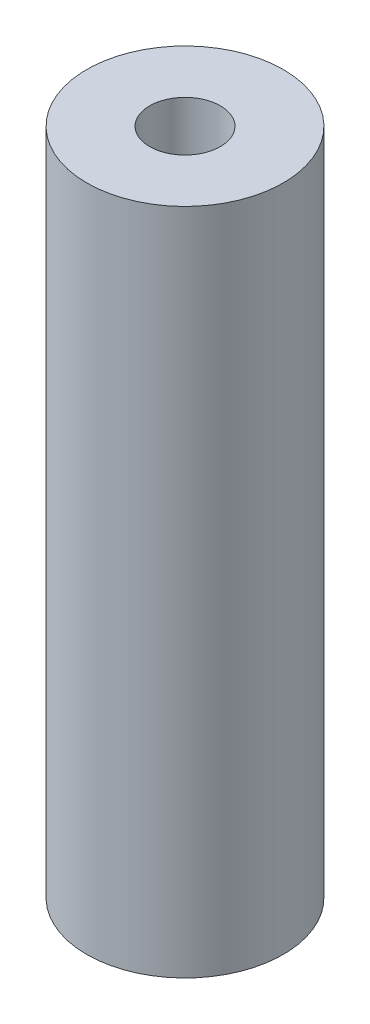
ISO-10303-21;
HEADER;
FILE_DESCRIPTION(('STEP AP214'),'2;1');
FILE_NAME('part.step','',(''),(''),'','','');
FILE_SCHEMA(('AUTOMOTIVE_DESIGN { 1 0 10303 214 1 1 1 1 }'));
ENDSEC;
DATA;
#1=APPLICATION_CONTEXT('core data for automotive mechanical design processes');
#2=APPLICATION_PROTOCOL_DEFINITION('international standard','automotive_design',2000,#1);
#3=PRODUCT_CONTEXT('',#1,'mechanical');
#4=PRODUCT('Part','Part','',(#3));
#5=PRODUCT_RELATED_PRODUCT_CATEGORY('part','',(#4));
#6=PRODUCT_DEFINITION_FORMATION('','',#4);
#7=PRODUCT_DEFINITION_CONTEXT('part definition',#1,'design');
#8=PRODUCT_DEFINITION('design','',#6,#7);
#9=PRODUCT_DEFINITION_SHAPE('','',#8);
#10=(LENGTH_UNIT() NAMED_UNIT(*) SI_UNIT(.MILLI.,.METRE.));
#11=(NAMED_UNIT(*) PLANE_ANGLE_UNIT() SI_UNIT($,.RADIAN.));
#12=(NAMED_UNIT(*) SI_UNIT($,.STERADIAN.) SOLID_ANGLE_UNIT());
#13=UNCERTAINTY_MEASURE_WITH_UNIT(LENGTH_MEASURE(1.E-05),#10,'distance_accuracy_value','');
#14=(GEOMETRIC_REPRESENTATION_CONTEXT(3) GLOBAL_UNCERTAINTY_ASSIGNED_CONTEXT((#13)) GLOBAL_UNIT_ASSIGNED_CONTEXT((#10,
#11,#12)) REPRESENTATION_CONTEXT('',''));
#15=CARTESIAN_POINT('',(0.,0.,0.));
#16=DIRECTION('',(0.,0.,1.));
#17=DIRECTION('',(1.,0.,0.));
#18=AXIS2_PLACEMENT_3D('',#15,#16,#17);
#19=CARTESIAN_POINT('',(0.,17.,0.));
#20=DIRECTION('',(0.,1.,0.));
#21=DIRECTION('',(0.,0.,1.));
#22=AXIS2_PLACEMENT_3D('',#19,#20,#21);
#23=PLANE('',#22);
#24=CARTESIAN_POINT('',(0.,17.,0.));
#25=DIRECTION('',(0.,1.,0.));
#26=DIRECTION('',(0.,0.,1.));
#27=AXIS2_PLACEMENT_3D('',#24,#25,#26);
#28=CIRCLE('',#27,2.5);
#29=CARTESIAN_POINT('',(0.,17.,2.5));
#30=VERTEX_POINT('',#29);
#31=EDGE_CURVE('E11',#30,#30,#28,.T.);
#32=ORIENTED_EDGE('',*,*,#31,.T.);
#33=EDGE_LOOP('',(#32));
#34=FACE_BOUND('',#33,.T.);
#35=CARTESIAN_POINT('',(0.,17.,0.));
#36=DIRECTION('',(0.,1.,0.));
#37=DIRECTION('',(0.,0.,1.));
#38=AXIS2_PLACEMENT_3D('',#35,#36,#37);
#39=CIRCLE('',#38,0.9);
#40=CARTESIAN_POINT('',(0.,17.,0.9));
#41=VERTEX_POINT('',#40);
#42=EDGE_CURVE('E54',#41,#41,#39,.T.);
#43=ORIENTED_EDGE('',*,*,#42,.F.);
#44=EDGE_LOOP('',(#43));
#45=FACE_BOUND('',#44,.T.);
#46=ADVANCED_FACE('F43',(#34,#45),#23,.T.);
#47=CARTESIAN_POINT('',(0.,0.,0.));
#48=DIRECTION('',(0.,1.,0.));
#49=DIRECTION('',(0.,0.,1.));
#50=AXIS2_PLACEMENT_3D('',#47,#48,#49);
#51=PLANE('',#50);
#52=CARTESIAN_POINT('',(0.,0.,0.));
#53=DIRECTION('',(0.,1.,0.));
#54=DIRECTION('',(0.,0.,1.));
#55=AXIS2_PLACEMENT_3D('',#52,#53,#54);
#56=CIRCLE('',#55,2.5);
#57=CARTESIAN_POINT('',(0.,0.,2.5));
#58=VERTEX_POINT('',#57);
#59=EDGE_CURVE('E47',#58,#58,#56,.T.);
#60=ORIENTED_EDGE('',*,*,#59,.F.);
#61=EDGE_LOOP('',(#60));
#62=FACE_BOUND('',#61,.T.);
#63=CARTESIAN_POINT('',(0.,0.,0.));
#64=DIRECTION('',(0.,1.,0.));
#65=DIRECTION('',(0.,0.,1.));
#66=AXIS2_PLACEMENT_3D('',#63,#64,#65);
#67=CIRCLE('',#66,0.9);
#68=CARTESIAN_POINT('',(0.,0.,0.9));
#69=VERTEX_POINT('',#68);
#70=EDGE_CURVE('E56',#69,#69,#67,.T.);
#71=ORIENTED_EDGE('',*,*,#70,.T.);
#72=EDGE_LOOP('',(#71));
#73=FACE_BOUND('',#72,.T.);
#74=ADVANCED_FACE('F66',(#62,#73),#51,.F.);
#75=CARTESIAN_POINT('',(0.,17.,0.));
#76=DIRECTION('',(0.,-1.,0.));
#77=DIRECTION('',(0.,0.,-1.));
#78=AXIS2_PLACEMENT_3D('',#75,#76,#77);
#79=CYLINDRICAL_SURFACE('',#78,2.5);
#80=ORIENTED_EDGE('',*,*,#31,.F.);
#81=EDGE_LOOP('',(#80));
#82=FACE_BOUND('',#81,.T.);
#83=ORIENTED_EDGE('',*,*,#59,.T.);
#84=EDGE_LOOP('',(#83));
#85=FACE_BOUND('',#84,.T.);
#86=ADVANCED_FACE('F45',(#82,#85),#79,.T.);
#87=CARTESIAN_POINT('',(0.,17.,0.));
#88=DIRECTION('',(0.,-1.,0.));
#89=DIRECTION('',(0.,0.,-1.));
#90=AXIS2_PLACEMENT_3D('',#87,#88,#89);
#91=CYLINDRICAL_SURFACE('',#90,0.9);
#92=ORIENTED_EDGE('',*,*,#42,.T.);
#93=EDGE_LOOP('',(#92));
#94=FACE_BOUND('',#93,.T.);
#95=ORIENTED_EDGE('',*,*,#70,.F.);
#96=EDGE_LOOP('',(#95));
#97=FACE_BOUND('',#96,.T.);
#98=ADVANCED_FACE('F62',(#94,#97),#91,.F.);
#99=CLOSED_SHELL('',(#46,#74,#86,#98));
#100=MANIFOLD_SOLID_BREP('B2',#99);
#101=ADVANCED_BREP_SHAPE_REPRESENTATION('',(#18,#100),#14);
#102=SHAPE_DEFINITION_REPRESENTATION(#9,#101);
ENDSEC;
END-ISO-10303-21;
